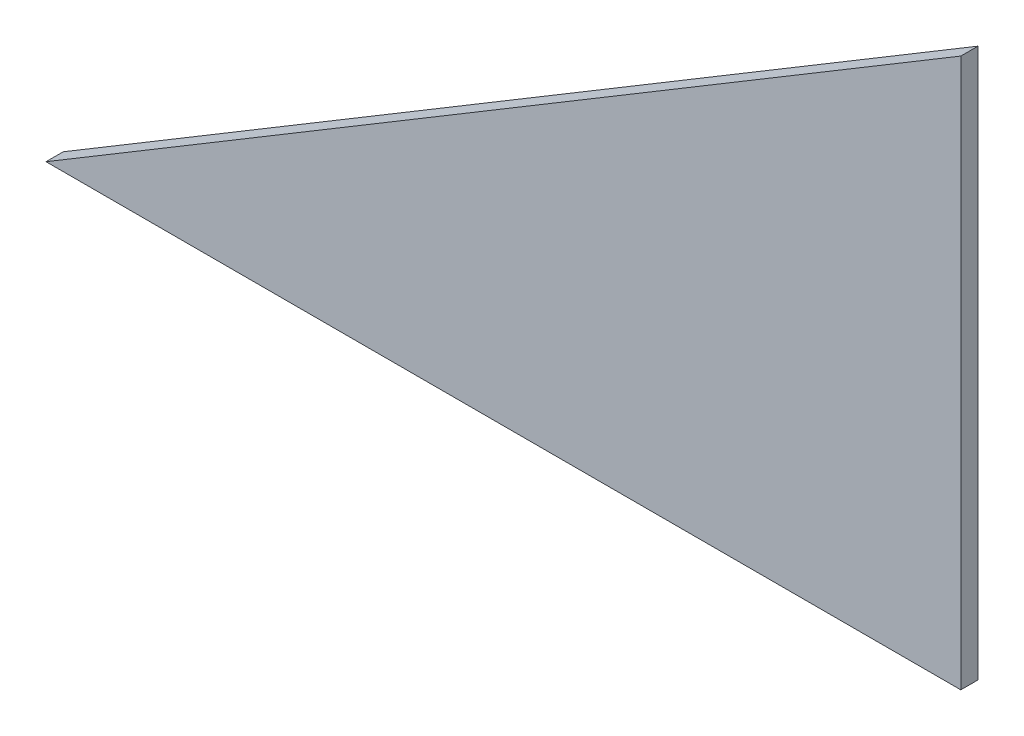
ISO-10303-21;
HEADER;
FILE_DESCRIPTION(('STEP AP214'),'2;1');
FILE_NAME('part.step','',(''),(''),'','','');
FILE_SCHEMA(('AUTOMOTIVE_DESIGN { 1 0 10303 214 1 1 1 1 }'));
ENDSEC;
DATA;
#1=APPLICATION_CONTEXT('core data for automotive mechanical design processes');
#2=APPLICATION_PROTOCOL_DEFINITION('international standard','automotive_design',2000,#1);
#3=PRODUCT_CONTEXT('',#1,'mechanical');
#4=PRODUCT('Part','Part','',(#3));
#5=PRODUCT_RELATED_PRODUCT_CATEGORY('part','',(#4));
#6=PRODUCT_DEFINITION_FORMATION('','',#4);
#7=PRODUCT_DEFINITION_CONTEXT('part definition',#1,'design');
#8=PRODUCT_DEFINITION('design','',#6,#7);
#9=PRODUCT_DEFINITION_SHAPE('','',#8);
#10=(LENGTH_UNIT() NAMED_UNIT(*) SI_UNIT(.MILLI.,.METRE.));
#11=(NAMED_UNIT(*) PLANE_ANGLE_UNIT() SI_UNIT($,.RADIAN.));
#12=(NAMED_UNIT(*) SI_UNIT($,.STERADIAN.) SOLID_ANGLE_UNIT());
#13=UNCERTAINTY_MEASURE_WITH_UNIT(LENGTH_MEASURE(1.E-05),#10,'distance_accuracy_value','');
#14=(GEOMETRIC_REPRESENTATION_CONTEXT(3) GLOBAL_UNCERTAINTY_ASSIGNED_CONTEXT((#13)) GLOBAL_UNIT_ASSIGNED_CONTEXT((#10,
#11,#12)) REPRESENTATION_CONTEXT('',''));
#15=CARTESIAN_POINT('',(0.,0.,0.));
#16=DIRECTION('',(0.,0.,1.));
#17=DIRECTION('',(1.,0.,0.));
#18=AXIS2_PLACEMENT_3D('',#15,#16,#17);
#19=CARTESIAN_POINT('',(0.,76.2,2.3876));
#20=DIRECTION('',(-1.,0.,0.));
#21=DIRECTION('',(0.,-1.,0.));
#22=AXIS2_PLACEMENT_3D('',#19,#20,#21);
#23=PLANE('',#22);
#24=DIRECTION('',(0.,1.,0.));
#25=VECTOR('',#24,1.);
#26=CARTESIAN_POINT('',(0.,76.2,0.));
#27=LINE('',#26,#25);
#28=CARTESIAN_POINT('',(0.,0.,0.));
#29=VERTEX_POINT('',#28);
#30=CARTESIAN_POINT('',(0.,76.2,0.));
#31=VERTEX_POINT('',#30);
#32=EDGE_CURVE('E88',#29,#31,#27,.T.);
#33=ORIENTED_EDGE('',*,*,#32,.T.);
#34=DIRECTION('',(0.,0.,-1.));
#35=VECTOR('',#34,1.);
#36=CARTESIAN_POINT('',(0.,76.2,2.3876));
#37=LINE('',#36,#35);
#38=CARTESIAN_POINT('',(0.,76.2,2.3876));
#39=VERTEX_POINT('',#38);
#40=EDGE_CURVE('E11',#39,#31,#37,.T.);
#41=ORIENTED_EDGE('',*,*,#40,.F.);
#42=DIRECTION('',(0.,1.,0.));
#43=VECTOR('',#42,1.);
#44=CARTESIAN_POINT('',(0.,76.2,2.3876));
#45=LINE('',#44,#43);
#46=CARTESIAN_POINT('',(0.,0.,2.3876));
#47=VERTEX_POINT('',#46);
#48=EDGE_CURVE('E81',#47,#39,#45,.T.);
#49=ORIENTED_EDGE('',*,*,#48,.F.);
#50=DIRECTION('',(0.,0.,-1.));
#51=VECTOR('',#50,1.);
#52=CARTESIAN_POINT('',(0.,0.,2.3876));
#53=LINE('',#52,#51);
#54=EDGE_CURVE('E89',#47,#29,#53,.T.);
#55=ORIENTED_EDGE('',*,*,#54,.T.);
#56=EDGE_LOOP('',(#33,#41,#49,#55));
#57=FACE_BOUND('',#56,.T.);
#58=ADVANCED_FACE('F41',(#57),#23,.F.);
#59=CARTESIAN_POINT('',(-127.,0.,2.3876));
#60=DIRECTION('',(0.514495755427527,-0.857492925712544,0.));
#61=DIRECTION('',(0.857492925712544,0.514495755427527,0.));
#62=AXIS2_PLACEMENT_3D('',#59,#60,#61);
#63=PLANE('',#62);
#64=DIRECTION('',(-0.857492925712544,-0.514495755427527,0.));
#65=VECTOR('',#64,1.);
#66=CARTESIAN_POINT('',(-127.,0.,0.));
#67=LINE('',#66,#65);
#68=CARTESIAN_POINT('',(-127.,0.,0.));
#69=VERTEX_POINT('',#68);
#70=EDGE_CURVE('E69',#31,#69,#67,.T.);
#71=ORIENTED_EDGE('',*,*,#70,.T.);
#72=DIRECTION('',(0.,0.,-1.));
#73=VECTOR('',#72,1.);
#74=CARTESIAN_POINT('',(-127.,0.,2.3876));
#75=LINE('',#74,#73);
#76=CARTESIAN_POINT('',(-127.,0.,2.3876));
#77=VERTEX_POINT('',#76);
#78=EDGE_CURVE('E49',#77,#69,#75,.T.);
#79=ORIENTED_EDGE('',*,*,#78,.F.);
#80=DIRECTION('',(-0.857492925712544,-0.514495755427527,0.));
#81=VECTOR('',#80,1.);
#82=CARTESIAN_POINT('',(-127.,0.,2.3876));
#83=LINE('',#82,#81);
#84=EDGE_CURVE('E77',#39,#77,#83,.T.);
#85=ORIENTED_EDGE('',*,*,#84,.F.);
#86=ORIENTED_EDGE('',*,*,#40,.T.);
#87=EDGE_LOOP('',(#71,#79,#85,#86));
#88=FACE_BOUND('',#87,.T.);
#89=ADVANCED_FACE('F78',(#88),#63,.F.);
#90=CARTESIAN_POINT('',(0.,0.,2.3876));
#91=DIRECTION('',(0.,1.,0.));
#92=DIRECTION('',(-1.,0.,0.));
#93=AXIS2_PLACEMENT_3D('',#90,#91,#92);
#94=PLANE('',#93);
#95=DIRECTION('',(1.,0.,0.));
#96=VECTOR('',#95,1.);
#97=CARTESIAN_POINT('',(0.,0.,0.));
#98=LINE('',#97,#96);
#99=EDGE_CURVE('E74',#69,#29,#98,.T.);
#100=ORIENTED_EDGE('',*,*,#99,.T.);
#101=ORIENTED_EDGE('',*,*,#54,.F.);
#102=DIRECTION('',(1.,0.,0.));
#103=VECTOR('',#102,1.);
#104=CARTESIAN_POINT('',(0.,0.,2.3876));
#105=LINE('',#104,#103);
#106=EDGE_CURVE('E57',#77,#47,#105,.T.);
#107=ORIENTED_EDGE('',*,*,#106,.F.);
#108=ORIENTED_EDGE('',*,*,#78,.T.);
#109=EDGE_LOOP('',(#100,#101,#107,#108));
#110=FACE_BOUND('',#109,.T.);
#111=ADVANCED_FACE('F96',(#110),#94,.F.);
#112=CARTESIAN_POINT('',(0.,0.,2.3876));
#113=DIRECTION('',(0.,0.,-1.));
#114=DIRECTION('',(-1.,0.,0.));
#115=AXIS2_PLACEMENT_3D('',#112,#113,#114);
#116=PLANE('',#115);
#117=ORIENTED_EDGE('',*,*,#48,.T.);
#118=ORIENTED_EDGE('',*,*,#84,.T.);
#119=ORIENTED_EDGE('',*,*,#106,.T.);
#120=EDGE_LOOP('',(#117,#118,#119));
#121=FACE_BOUND('',#120,.T.);
#122=ADVANCED_FACE('F84',(#121),#116,.F.);
#123=CARTESIAN_POINT('',(0.,0.,0.));
#124=DIRECTION('',(0.,0.,-1.));
#125=DIRECTION('',(-1.,0.,0.));
#126=AXIS2_PLACEMENT_3D('',#123,#124,#125);
#127=PLANE('',#126);
#128=ORIENTED_EDGE('',*,*,#32,.F.);
#129=ORIENTED_EDGE('',*,*,#99,.F.);
#130=ORIENTED_EDGE('',*,*,#70,.F.);
#131=EDGE_LOOP('',(#128,#129,#130));
#132=FACE_BOUND('',#131,.T.);
#133=ADVANCED_FACE('F97',(#132),#127,.T.);
#134=CLOSED_SHELL('',(#58,#89,#111,#122,#133));
#135=MANIFOLD_SOLID_BREP('B2',#134);
#136=ADVANCED_BREP_SHAPE_REPRESENTATION('',(#18,#135),#14);
#137=SHAPE_DEFINITION_REPRESENTATION(#9,#136);
ENDSEC;
END-ISO-10303-21;
